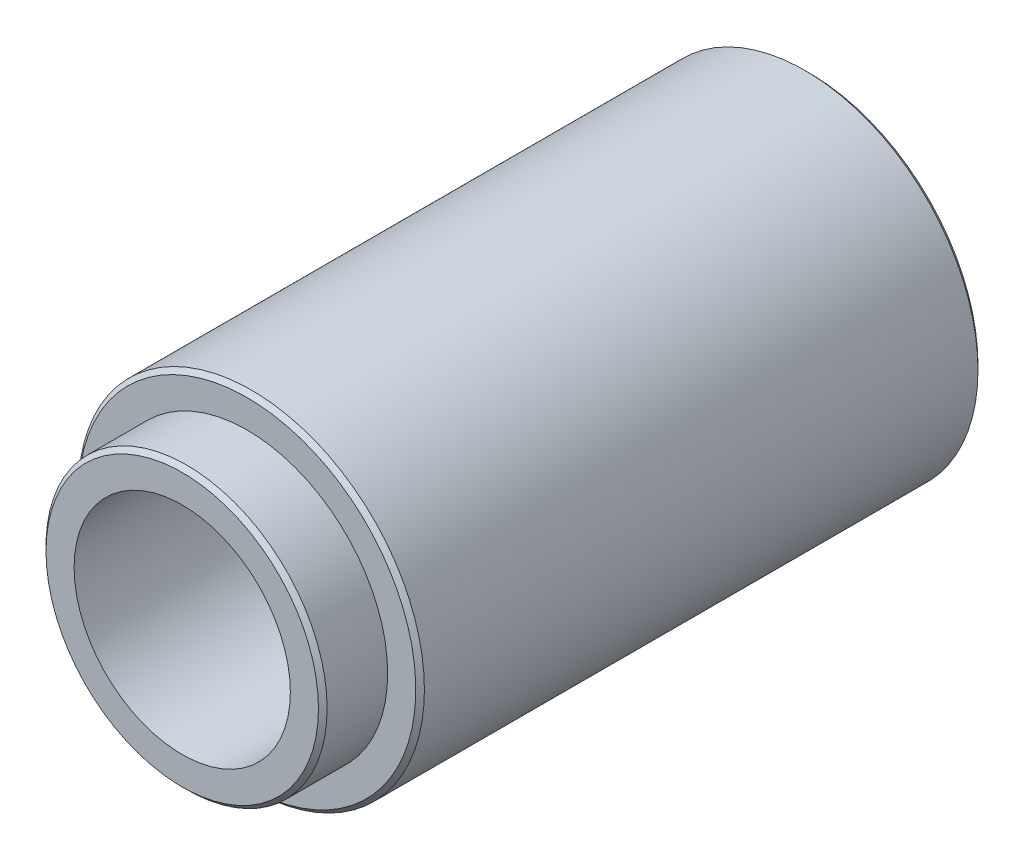
ISO-10303-21;
HEADER;
FILE_DESCRIPTION(('STEP AP214'),'2;1');
FILE_NAME('part.step','',(''),(''),'','','');
FILE_SCHEMA(('AUTOMOTIVE_DESIGN { 1 0 10303 214 1 1 1 1 }'));
ENDSEC;
DATA;
#1=APPLICATION_CONTEXT('core data for automotive mechanical design processes');
#2=APPLICATION_PROTOCOL_DEFINITION('international standard','automotive_design',2000,#1);
#3=PRODUCT_CONTEXT('',#1,'mechanical');
#4=PRODUCT('Part','Part','',(#3));
#5=PRODUCT_RELATED_PRODUCT_CATEGORY('part','',(#4));
#6=PRODUCT_DEFINITION_FORMATION('','',#4);
#7=PRODUCT_DEFINITION_CONTEXT('part definition',#1,'design');
#8=PRODUCT_DEFINITION('design','',#6,#7);
#9=PRODUCT_DEFINITION_SHAPE('','',#8);
#10=(LENGTH_UNIT() NAMED_UNIT(*) SI_UNIT(.MILLI.,.METRE.));
#11=(NAMED_UNIT(*) PLANE_ANGLE_UNIT() SI_UNIT($,.RADIAN.));
#12=(NAMED_UNIT(*) SI_UNIT($,.STERADIAN.) SOLID_ANGLE_UNIT());
#13=UNCERTAINTY_MEASURE_WITH_UNIT(LENGTH_MEASURE(1.E-05),#10,'distance_accuracy_value','');
#14=(GEOMETRIC_REPRESENTATION_CONTEXT(3) GLOBAL_UNCERTAINTY_ASSIGNED_CONTEXT((#13)) GLOBAL_UNIT_ASSIGNED_CONTEXT((#10,
#11,#12)) REPRESENTATION_CONTEXT('',''));
#15=CARTESIAN_POINT('',(0.,0.,0.));
#16=DIRECTION('',(0.,0.,1.));
#17=DIRECTION('',(1.,0.,0.));
#18=AXIS2_PLACEMENT_3D('',#15,#16,#17);
#19=CARTESIAN_POINT('',(0.,0.,26.));
#20=DIRECTION('',(0.,0.,-1.));
#21=DIRECTION('',(-1.,0.,0.));
#22=AXIS2_PLACEMENT_3D('',#19,#20,#21);
#23=CYLINDRICAL_SURFACE('',#22,8.);
#24=CARTESIAN_POINT('',(0.,0.,0.200000000000023));
#25=DIRECTION('',(0.,0.,1.));
#26=DIRECTION('',(1.,0.,0.));
#27=AXIS2_PLACEMENT_3D('',#24,#25,#26);
#28=CIRCLE('',#27,8.);
#29=CARTESIAN_POINT('',(-8.,0.,0.20000000000002));
#30=VERTEX_POINT('',#29);
#31=EDGE_CURVE('E55',#30,#30,#28,.T.);
#32=CARTESIAN_POINT('',(0.,0.,25.8));
#33=DIRECTION('',(0.,0.,1.));
#34=DIRECTION('',(1.,0.,0.));
#35=AXIS2_PLACEMENT_3D('',#32,#33,#34);
#36=CIRCLE('',#35,8.);
#37=CARTESIAN_POINT('',(-8.,0.,25.8));
#38=VERTEX_POINT('',#37);
#39=EDGE_CURVE('E58',#38,#38,#36,.F.);
#40=CARTESIAN_POINT('',(-8.,0.,0.20000000000002));
#41=CARTESIAN_POINT('',(-8.,0.,0.466666666666686));
#42=CARTESIAN_POINT('',(-8.,0.,0.733333333333352));
#43=CARTESIAN_POINT('',(-8.,0.,1.26666666666669));
#44=CARTESIAN_POINT('',(-8.,0.,1.53333333333335));
#45=CARTESIAN_POINT('',(-8.,0.,2.06666666666669));
#46=CARTESIAN_POINT('',(-8.,0.,2.33333333333335));
#47=CARTESIAN_POINT('',(-8.,0.,2.86666666666668));
#48=CARTESIAN_POINT('',(-8.,0.,3.13333333333335));
#49=CARTESIAN_POINT('',(-8.,0.,3.66666666666668));
#50=CARTESIAN_POINT('',(-8.,0.,3.93333333333335));
#51=CARTESIAN_POINT('',(-8.,0.,4.46666666666668));
#52=CARTESIAN_POINT('',(-8.,0.,4.73333333333335));
#53=CARTESIAN_POINT('',(-8.,0.,5.26666666666668));
#54=CARTESIAN_POINT('',(-8.,0.,5.53333333333335));
#55=CARTESIAN_POINT('',(-8.,0.,6.06666666666668));
#56=CARTESIAN_POINT('',(-8.,0.,6.33333333333335));
#57=CARTESIAN_POINT('',(-8.,0.,6.86666666666668));
#58=CARTESIAN_POINT('',(-8.,0.,7.13333333333335));
#59=CARTESIAN_POINT('',(-8.,0.,7.66666666666668));
#60=CARTESIAN_POINT('',(-8.,0.,7.93333333333335));
#61=CARTESIAN_POINT('',(-8.,0.,8.46666666666668));
#62=CARTESIAN_POINT('',(-8.,0.,8.73333333333335));
#63=CARTESIAN_POINT('',(-8.,0.,9.26666666666668));
#64=CARTESIAN_POINT('',(-8.,0.,9.53333333333335));
#65=CARTESIAN_POINT('',(-8.,0.,10.0666666666667));
#66=CARTESIAN_POINT('',(-8.,0.,10.3333333333333));
#67=CARTESIAN_POINT('',(-8.,0.,10.8666666666667));
#68=CARTESIAN_POINT('',(-8.,0.,11.1333333333333));
#69=CARTESIAN_POINT('',(-8.,0.,11.6666666666667));
#70=CARTESIAN_POINT('',(-8.,0.,11.9333333333333));
#71=CARTESIAN_POINT('',(-8.,0.,12.4666666666667));
#72=CARTESIAN_POINT('',(-8.,0.,12.7333333333333));
#73=CARTESIAN_POINT('',(-8.,0.,13.2666666666667));
#74=CARTESIAN_POINT('',(-8.,0.,13.5333333333333));
#75=CARTESIAN_POINT('',(-8.,0.,14.0666666666667));
#76=CARTESIAN_POINT('',(-8.,0.,14.3333333333333));
#77=CARTESIAN_POINT('',(-8.,0.,14.8666666666667));
#78=CARTESIAN_POINT('',(-8.,0.,15.1333333333333));
#79=CARTESIAN_POINT('',(-8.,0.,15.6666666666667));
#80=CARTESIAN_POINT('',(-8.,0.,15.9333333333333));
#81=CARTESIAN_POINT('',(-8.,0.,16.4666666666667));
#82=CARTESIAN_POINT('',(-8.,0.,16.7333333333333));
#83=CARTESIAN_POINT('',(-8.,0.,17.2666666666667));
#84=CARTESIAN_POINT('',(-8.,0.,17.5333333333333));
#85=CARTESIAN_POINT('',(-8.,0.,18.0666666666667));
#86=CARTESIAN_POINT('',(-8.,0.,18.3333333333333));
#87=CARTESIAN_POINT('',(-8.,0.,18.8666666666667));
#88=CARTESIAN_POINT('',(-8.,0.,19.1333333333333));
#89=CARTESIAN_POINT('',(-8.,0.,19.6666666666667));
#90=CARTESIAN_POINT('',(-8.,0.,19.9333333333333));
#91=CARTESIAN_POINT('',(-8.,0.,20.4666666666667));
#92=CARTESIAN_POINT('',(-8.,0.,20.7333333333333));
#93=CARTESIAN_POINT('',(-8.,0.,21.2666666666667));
#94=CARTESIAN_POINT('',(-8.,0.,21.5333333333333));
#95=CARTESIAN_POINT('',(-8.,0.,22.0666666666667));
#96=CARTESIAN_POINT('',(-8.,0.,22.3333333333333));
#97=CARTESIAN_POINT('',(-8.,0.,22.8666666666667));
#98=CARTESIAN_POINT('',(-8.,0.,23.1333333333333));
#99=CARTESIAN_POINT('',(-8.,0.,23.6666666666667));
#100=CARTESIAN_POINT('',(-8.,0.,23.9333333333333));
#101=CARTESIAN_POINT('',(-8.,0.,24.4666666666667));
#102=CARTESIAN_POINT('',(-8.,0.,24.7333333333333));
#103=CARTESIAN_POINT('',(-8.,0.,25.2666666666667));
#104=CARTESIAN_POINT('',(-8.,0.,25.5333333333333));
#105=CARTESIAN_POINT('',(-8.,0.,25.8));
#106=B_SPLINE_CURVE_WITH_KNOTS('',3,(#40,#41,#42,#43,#44,#45,#46,#47,#48,#49,#50,#51,#52,#53,
#54,#55,#56,#57,#58,#59,#60,#61,#62,#63,#64,#65,#66,#67,#68,#69,#70,#71,#72,#73,#74,#75,#76,#77,
#78,#79,#80,#81,#82,#83,#84,#85,#86,#87,#88,#89,#90,#91,#92,#93,#94,#95,#96,#97,#98,#99,#100,
#101,#102,#103,#104,#105),.UNSPECIFIED.,.F.,.F.,(4,2,2,2,2,2,2,2,2,2,2,2,2,2,2,2,2,2,2,2,2,2,2,
2,2,2,2,2,2,2,2,2,4),(0.,0.799999999999999,1.6,2.4,3.2,4.,4.8,5.6,6.4,7.2,8.,8.8,9.6,10.4,11.2,
12.,12.8,13.6,14.4,15.2,16.,16.8,17.6,18.4,19.2,20.,20.8,21.6,22.4,23.2,24.,24.8,25.6),.UNSPECIFIED.);
#107=EDGE_CURVE('BSEAM34',#30,#38,#106,.T.);
#108=ORIENTED_EDGE('',*,*,#31,.T.);
#109=ORIENTED_EDGE('',*,*,#39,.T.);
#110=ORIENTED_EDGE('',*,*,#107,.T.);
#111=ORIENTED_EDGE('',*,*,#107,.F.);
#112=EDGE_LOOP('',(#108,#110,#109,#111));
#113=FACE_BOUND('',#112,.T.);
#114=ADVANCED_FACE('F34',(#113),#23,.T.);
#115=CARTESIAN_POINT('',(0.,0.,26.));
#116=DIRECTION('',(0.,0.,1.));
#117=DIRECTION('',(1.,0.,0.));
#118=AXIS2_PLACEMENT_3D('',#115,#116,#117);
#119=PLANE('',#118);
#120=CARTESIAN_POINT('',(0.,0.,26.));
#121=DIRECTION('',(0.,0.,1.));
#122=DIRECTION('',(1.,0.,0.));
#123=AXIS2_PLACEMENT_3D('',#120,#121,#122);
#124=CIRCLE('',#123,7.80000000000001);
#125=CARTESIAN_POINT('',(-7.80000000000001,0.,26.));
#126=VERTEX_POINT('',#125);
#127=EDGE_CURVE('E46',#126,#126,#124,.T.);
#128=ORIENTED_EDGE('',*,*,#127,.T.);
#129=EDGE_LOOP('',(#128));
#130=FACE_BOUND('',#129,.T.);
#131=CARTESIAN_POINT('',(0.,0.,26.));
#132=DIRECTION('',(0.,0.,1.));
#133=DIRECTION('',(1.,0.,0.));
#134=AXIS2_PLACEMENT_3D('',#131,#132,#133);
#135=CIRCLE('',#134,6.5);
#136=CARTESIAN_POINT('',(6.5,0.,26.));
#137=VERTEX_POINT('',#136);
#138=EDGE_CURVE('E61',#137,#137,#135,.T.);
#139=ORIENTED_EDGE('',*,*,#138,.F.);
#140=EDGE_LOOP('',(#139));
#141=FACE_BOUND('',#140,.T.);
#142=ADVANCED_FACE('F83',(#130,#141),#119,.T.);
#143=CARTESIAN_POINT('',(0.,0.,0.));
#144=DIRECTION('',(0.,0.,1.));
#145=DIRECTION('',(1.,0.,0.));
#146=AXIS2_PLACEMENT_3D('',#143,#144,#145);
#147=PLANE('',#146);
#148=CARTESIAN_POINT('',(0.,0.,0.));
#149=DIRECTION('',(0.,0.,1.));
#150=DIRECTION('',(1.,0.,0.));
#151=AXIS2_PLACEMENT_3D('',#148,#149,#150);
#152=CIRCLE('',#151,7.79999999999997);
#153=CARTESIAN_POINT('',(7.79999999999997,0.,0.));
#154=VERTEX_POINT('',#153);
#155=EDGE_CURVE('E50',#154,#154,#152,.F.);
#156=ORIENTED_EDGE('',*,*,#155,.T.);
#157=EDGE_LOOP('',(#156));
#158=FACE_BOUND('',#157,.T.);
#159=CARTESIAN_POINT('',(0.,0.,0.));
#160=DIRECTION('',(0.,0.,1.));
#161=DIRECTION('',(1.,0.,0.));
#162=AXIS2_PLACEMENT_3D('',#159,#160,#161);
#163=CIRCLE('',#162,5.);
#164=CARTESIAN_POINT('',(5.,0.,0.));
#165=VERTEX_POINT('',#164);
#166=EDGE_CURVE('E64',#165,#165,#163,.T.);
#167=ORIENTED_EDGE('',*,*,#166,.T.);
#168=EDGE_LOOP('',(#167));
#169=FACE_BOUND('',#168,.T.);
#170=ADVANCED_FACE('F80',(#158,#169),#147,.F.);
#171=CARTESIAN_POINT('',(0.,0.,29.));
#172=DIRECTION('',(0.,0.,-1.));
#173=DIRECTION('',(-1.,0.,0.));
#174=AXIS2_PLACEMENT_3D('',#171,#172,#173);
#175=CYLINDRICAL_SURFACE('',#174,6.5);
#176=CARTESIAN_POINT('',(0.,0.,28.8));
#177=DIRECTION('',(0.,0.,1.));
#178=DIRECTION('',(1.,0.,0.));
#179=AXIS2_PLACEMENT_3D('',#176,#177,#178);
#180=CIRCLE('',#179,6.5);
#181=CARTESIAN_POINT('',(6.5,0.,28.8));
#182=VERTEX_POINT('',#181);
#183=EDGE_CURVE('E10',#182,#182,#180,.F.);
#184=ORIENTED_EDGE('',*,*,#183,.T.);
#185=EDGE_LOOP('',(#184));
#186=FACE_BOUND('',#185,.T.);
#187=ORIENTED_EDGE('',*,*,#138,.T.);
#188=EDGE_LOOP('',(#187));
#189=FACE_BOUND('',#188,.T.);
#190=ADVANCED_FACE('F82',(#186,#189),#175,.T.);
#191=CARTESIAN_POINT('',(0.,0.,29.));
#192=DIRECTION('',(0.,0.,1.));
#193=DIRECTION('',(1.,0.,0.));
#194=AXIS2_PLACEMENT_3D('',#191,#192,#193);
#195=PLANE('',#194);
#196=CARTESIAN_POINT('',(0.,0.,29.));
#197=DIRECTION('',(0.,0.,1.));
#198=DIRECTION('',(1.,0.,0.));
#199=AXIS2_PLACEMENT_3D('',#196,#197,#198);
#200=CIRCLE('',#199,6.3);
#201=CARTESIAN_POINT('',(6.3,0.,29.));
#202=VERTEX_POINT('',#201);
#203=EDGE_CURVE('E42',#202,#202,#200,.T.);
#204=ORIENTED_EDGE('',*,*,#203,.T.);
#205=EDGE_LOOP('',(#204));
#206=FACE_BOUND('',#205,.T.);
#207=CARTESIAN_POINT('',(0.,0.,29.));
#208=DIRECTION('',(0.,0.,-1.));
#209=DIRECTION('',(-1.,0.,0.));
#210=AXIS2_PLACEMENT_3D('',#207,#208,#209);
#211=CIRCLE('',#210,5.);
#212=CARTESIAN_POINT('',(-5.,0.,29.));
#213=VERTEX_POINT('',#212);
#214=EDGE_CURVE('E67',#213,#213,#211,.T.);
#215=ORIENTED_EDGE('',*,*,#214,.T.);
#216=EDGE_LOOP('',(#215));
#217=FACE_BOUND('',#216,.T.);
#218=ADVANCED_FACE('F71',(#206,#217),#195,.T.);
#219=CARTESIAN_POINT('',(0.,0.,29.));
#220=DIRECTION('',(0.,0.,-1.));
#221=DIRECTION('',(-1.,0.,0.));
#222=AXIS2_PLACEMENT_3D('',#219,#220,#221);
#223=CYLINDRICAL_SURFACE('',#222,5.);
#224=ORIENTED_EDGE('',*,*,#214,.F.);
#225=EDGE_LOOP('',(#224));
#226=FACE_BOUND('',#225,.T.);
#227=ORIENTED_EDGE('',*,*,#166,.F.);
#228=EDGE_LOOP('',(#227));
#229=FACE_BOUND('',#228,.T.);
#230=ADVANCED_FACE('F73',(#226,#229),#223,.F.);
#231=CARTESIAN_POINT('',(0.,0.,0.200000000000023));
#232=DIRECTION('',(0.,0.,1.));
#233=DIRECTION('',(1.,0.,0.));
#234=AXIS2_PLACEMENT_3D('',#231,#232,#233);
#235=CONICAL_SURFACE('',#234,8.,0.785398163397453);
#236=ORIENTED_EDGE('',*,*,#155,.F.);
#237=EDGE_LOOP('',(#236));
#238=FACE_BOUND('',#237,.T.);
#239=ORIENTED_EDGE('',*,*,#31,.F.);
#240=EDGE_LOOP('',(#239));
#241=FACE_BOUND('',#240,.T.);
#242=ADVANCED_FACE('F76',(#238,#241),#235,.T.);
#243=CARTESIAN_POINT('',(0.,0.,26.));
#244=DIRECTION('',(0.,0.,-1.));
#245=DIRECTION('',(-1.,0.,0.));
#246=AXIS2_PLACEMENT_3D('',#243,#244,#245);
#247=CONICAL_SURFACE('',#246,7.80000000000001,0.785398163397444);
#248=CARTESIAN_POINT('',(-8.,0.,25.8));
#249=CARTESIAN_POINT('',(-7.99791666666667,0.,25.8020833333333));
#250=CARTESIAN_POINT('',(-7.99583333333334,0.,25.8041666666667));
#251=CARTESIAN_POINT('',(-7.99166666666667,0.,25.8083333333333));
#252=CARTESIAN_POINT('',(-7.98958333333334,0.,25.8104166666667));
#253=CARTESIAN_POINT('',(-7.98541666666667,0.,25.8145833333333));
#254=CARTESIAN_POINT('',(-7.98333333333334,0.,25.8166666666667));
#255=CARTESIAN_POINT('',(-7.97916666666667,0.,25.8208333333333));
#256=CARTESIAN_POINT('',(-7.97708333333334,0.,25.8229166666667));
#257=CARTESIAN_POINT('',(-7.97291666666667,0.,25.8270833333333));
#258=CARTESIAN_POINT('',(-7.97083333333334,0.,25.8291666666667));
#259=CARTESIAN_POINT('',(-7.96666666666667,0.,25.8333333333333));
#260=CARTESIAN_POINT('',(-7.96458333333334,0.,25.8354166666667));
#261=CARTESIAN_POINT('',(-7.96041666666667,0.,25.8395833333333));
#262=CARTESIAN_POINT('',(-7.95833333333334,0.,25.8416666666667));
#263=CARTESIAN_POINT('',(-7.95416666666667,0.,25.8458333333333));
#264=CARTESIAN_POINT('',(-7.95208333333334,0.,25.8479166666667));
#265=CARTESIAN_POINT('',(-7.94791666666667,0.,25.8520833333333));
#266=CARTESIAN_POINT('',(-7.94583333333334,0.,25.8541666666667));
#267=CARTESIAN_POINT('',(-7.94166666666667,0.,25.8583333333333));
#268=CARTESIAN_POINT('',(-7.93958333333334,0.,25.8604166666667));
#269=CARTESIAN_POINT('',(-7.93541666666667,0.,25.8645833333333));
#270=CARTESIAN_POINT('',(-7.93333333333334,0.,25.8666666666667));
#271=CARTESIAN_POINT('',(-7.92916666666667,0.,25.8708333333333));
#272=CARTESIAN_POINT('',(-7.92708333333334,0.,25.8729166666667));
#273=CARTESIAN_POINT('',(-7.92291666666667,0.,25.8770833333333));
#274=CARTESIAN_POINT('',(-7.92083333333334,0.,25.8791666666667));
#275=CARTESIAN_POINT('',(-7.91666666666667,0.,25.8833333333333));
#276=CARTESIAN_POINT('',(-7.91458333333334,0.,25.8854166666667));
#277=CARTESIAN_POINT('',(-7.91041666666668,0.,25.8895833333333));
#278=CARTESIAN_POINT('',(-7.90833333333334,0.,25.8916666666667));
#279=CARTESIAN_POINT('',(-7.90416666666668,0.,25.8958333333333));
#280=CARTESIAN_POINT('',(-7.90208333333334,0.,25.8979166666667));
#281=CARTESIAN_POINT('',(-7.89791666666668,0.,25.9020833333333));
#282=CARTESIAN_POINT('',(-7.89583333333334,0.,25.9041666666667));
#283=CARTESIAN_POINT('',(-7.89166666666668,0.,25.9083333333333));
#284=CARTESIAN_POINT('',(-7.88958333333334,0.,25.9104166666667));
#285=CARTESIAN_POINT('',(-7.88541666666668,0.,25.9145833333333));
#286=CARTESIAN_POINT('',(-7.88333333333334,0.,25.9166666666667));
#287=CARTESIAN_POINT('',(-7.87916666666668,0.,25.9208333333333));
#288=CARTESIAN_POINT('',(-7.87708333333334,0.,25.9229166666667));
#289=CARTESIAN_POINT('',(-7.87291666666668,0.,25.9270833333333));
#290=CARTESIAN_POINT('',(-7.87083333333334,0.,25.9291666666667));
#291=CARTESIAN_POINT('',(-7.86666666666668,0.,25.9333333333333));
#292=CARTESIAN_POINT('',(-7.86458333333334,0.,25.9354166666667));
#293=CARTESIAN_POINT('',(-7.86041666666668,0.,25.9395833333333));
#294=CARTESIAN_POINT('',(-7.85833333333334,0.,25.9416666666667));
#295=CARTESIAN_POINT('',(-7.85416666666668,0.,25.9458333333333));
#296=CARTESIAN_POINT('',(-7.85208333333334,0.,25.9479166666667));
#297=CARTESIAN_POINT('',(-7.84791666666668,0.,25.9520833333333));
#298=CARTESIAN_POINT('',(-7.84583333333335,0.,25.9541666666667));
#299=CARTESIAN_POINT('',(-7.84166666666668,0.,25.9583333333333));
#300=CARTESIAN_POINT('',(-7.83958333333335,0.,25.9604166666667));
#301=CARTESIAN_POINT('',(-7.83541666666668,0.,25.9645833333333));
#302=CARTESIAN_POINT('',(-7.83333333333335,0.,25.9666666666667));
#303=CARTESIAN_POINT('',(-7.82916666666668,0.,25.9708333333333));
#304=CARTESIAN_POINT('',(-7.82708333333335,0.,25.9729166666667));
#305=CARTESIAN_POINT('',(-7.82291666666668,0.,25.9770833333333));
#306=CARTESIAN_POINT('',(-7.82083333333335,0.,25.9791666666667));
#307=CARTESIAN_POINT('',(-7.81666666666668,0.,25.9833333333333));
#308=CARTESIAN_POINT('',(-7.81458333333335,0.,25.9854166666667));
#309=CARTESIAN_POINT('',(-7.81041666666668,0.,25.9895833333333));
#310=CARTESIAN_POINT('',(-7.80833333333335,0.,25.9916666666667));
#311=CARTESIAN_POINT('',(-7.80416666666668,0.,25.9958333333333));
#312=CARTESIAN_POINT('',(-7.80208333333335,0.,25.9979166666667));
#313=CARTESIAN_POINT('',(-7.80000000000001,0.,26.));
#314=B_SPLINE_CURVE_WITH_KNOTS('',3,(#248,#249,#250,#251,#252,#253,#254,#255,#256,#257,#258,
#259,#260,#261,#262,#263,#264,#265,#266,#267,#268,#269,#270,#271,#272,#273,#274,#275,#276,#277,
#278,#279,#280,#281,#282,#283,#284,#285,#286,#287,#288,#289,#290,#291,#292,#293,#294,#295,#296,
#297,#298,#299,#300,#301,#302,#303,#304,#305,#306,#307,#308,#309,#310,#311,#312,#313),
.UNSPECIFIED.,.F.,.F.,(4,2,2,2,2,2,2,2,2,2,2,2,2,2,2,2,2,2,2,2,2,2,2,2,2,2,2,2,2,2,2,2,4),(0.,
0.00883883476483332,0.0176776695296642,0.0265165042944951,0.0353553390593272,0.044194173824158,
0.0530330085889889,0.0618718433538198,0.0707106781186506,0.0795495128834815,0.0883883476483136,
0.0972271824131469,0.106066017177978,0.114904851942809,0.12374368670764,0.13258252147247,
0.141421356237301,0.150260191002133,0.159099025766964,0.167937860531795,0.176776695296626,
0.185615530061457,0.19445436482629,0.203293199591122,0.212132034355953,0.220970869120784,
0.229809703885615,0.238648538650446,0.247487373415277,0.256326208180109,0.26516504294494,
0.274003877709771,0.282842712474604),.UNSPECIFIED.);
#315=EDGE_CURVE('BSEAM105',#38,#126,#314,.T.);
#316=ORIENTED_EDGE('',*,*,#39,.F.);
#317=ORIENTED_EDGE('',*,*,#127,.F.);
#318=ORIENTED_EDGE('',*,*,#315,.T.);
#319=ORIENTED_EDGE('',*,*,#315,.F.);
#320=EDGE_LOOP('',(#316,#318,#317,#319));
#321=FACE_BOUND('',#320,.T.);
#322=ADVANCED_FACE('F105',(#321),#247,.T.);
#323=CARTESIAN_POINT('',(0.,0.,29.));
#324=DIRECTION('',(0.,0.,-1.));
#325=DIRECTION('',(-1.,0.,0.));
#326=AXIS2_PLACEMENT_3D('',#323,#324,#325);
#327=CONICAL_SURFACE('',#326,6.3,0.785398163397453);
#328=ORIENTED_EDGE('',*,*,#183,.F.);
#329=EDGE_LOOP('',(#328));
#330=FACE_BOUND('',#329,.T.);
#331=ORIENTED_EDGE('',*,*,#203,.F.);
#332=EDGE_LOOP('',(#331));
#333=FACE_BOUND('',#332,.T.);
#334=ADVANCED_FACE('F37',(#330,#333),#327,.T.);
#335=CLOSED_SHELL('',(#114,#142,#170,#190,#218,#230,#242,#322,#334));
#336=MANIFOLD_SOLID_BREP('B2',#335);
#337=ADVANCED_BREP_SHAPE_REPRESENTATION('',(#18,#336),#14);
#338=SHAPE_DEFINITION_REPRESENTATION(#9,#337);
ENDSEC;
END-ISO-10303-21;
